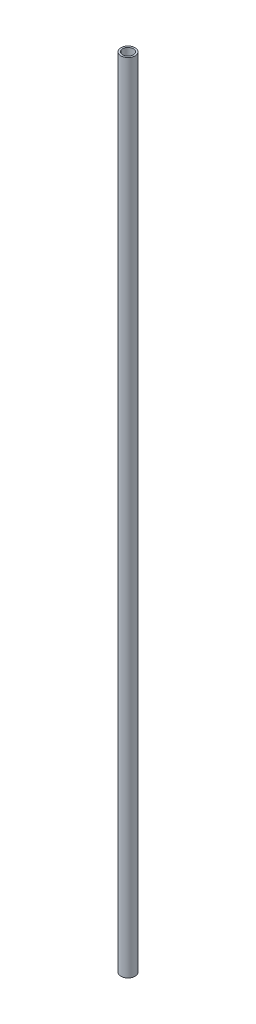
ISO-10303-21;
HEADER;
FILE_DESCRIPTION(('STEP AP214'),'2;1');
FILE_NAME('part.step','',(''),(''),'','','');
FILE_SCHEMA(('AUTOMOTIVE_DESIGN { 1 0 10303 214 1 1 1 1 }'));
ENDSEC;
DATA;
#1=APPLICATION_CONTEXT('core data for automotive mechanical design processes');
#2=APPLICATION_PROTOCOL_DEFINITION('international standard','automotive_design',2000,#1);
#3=PRODUCT_CONTEXT('',#1,'mechanical');
#4=PRODUCT('Part','Part','',(#3));
#5=PRODUCT_RELATED_PRODUCT_CATEGORY('part','',(#4));
#6=PRODUCT_DEFINITION_FORMATION('','',#4);
#7=PRODUCT_DEFINITION_CONTEXT('part definition',#1,'design');
#8=PRODUCT_DEFINITION('design','',#6,#7);
#9=PRODUCT_DEFINITION_SHAPE('','',#8);
#10=(LENGTH_UNIT() NAMED_UNIT(*) SI_UNIT(.MILLI.,.METRE.));
#11=(NAMED_UNIT(*) PLANE_ANGLE_UNIT() SI_UNIT($,.RADIAN.));
#12=(NAMED_UNIT(*) SI_UNIT($,.STERADIAN.) SOLID_ANGLE_UNIT());
#13=UNCERTAINTY_MEASURE_WITH_UNIT(LENGTH_MEASURE(1.E-05),#10,'distance_accuracy_value','');
#14=(GEOMETRIC_REPRESENTATION_CONTEXT(3) GLOBAL_UNCERTAINTY_ASSIGNED_CONTEXT((#13)) GLOBAL_UNIT_ASSIGNED_CONTEXT((#10,
#11,#12)) REPRESENTATION_CONTEXT('',''));
#15=CARTESIAN_POINT('',(0.,0.,0.));
#16=DIRECTION('',(0.,0.,1.));
#17=DIRECTION('',(1.,0.,0.));
#18=AXIS2_PLACEMENT_3D('',#15,#16,#17);
#19=CARTESIAN_POINT('',(0.,0.,0.));
#20=DIRECTION('',(0.,1.,0.));
#21=DIRECTION('',(0.,0.,1.));
#22=AXIS2_PLACEMENT_3D('',#19,#20,#21);
#23=CYLINDRICAL_SURFACE('',#22,4.);
#24=CARTESIAN_POINT('',(0.,450.,0.));
#25=DIRECTION('',(0.,1.,0.));
#26=DIRECTION('',(0.,0.,1.));
#27=AXIS2_PLACEMENT_3D('',#24,#25,#26);
#28=CIRCLE('',#27,4.);
#29=CARTESIAN_POINT('',(0.,450.,4.));
#30=VERTEX_POINT('',#29);
#31=EDGE_CURVE('E50',#30,#30,#28,.T.);
#32=ORIENTED_EDGE('',*,*,#31,.F.);
#33=EDGE_LOOP('',(#32));
#34=FACE_BOUND('',#33,.T.);
#35=CARTESIAN_POINT('',(0.,0.,0.));
#36=DIRECTION('',(0.,1.,0.));
#37=DIRECTION('',(0.,0.,1.));
#38=AXIS2_PLACEMENT_3D('',#35,#36,#37);
#39=CIRCLE('',#38,4.);
#40=CARTESIAN_POINT('',(0.,0.,4.));
#41=VERTEX_POINT('',#40);
#42=EDGE_CURVE('E35',#41,#41,#39,.T.);
#43=ORIENTED_EDGE('',*,*,#42,.T.);
#44=EDGE_LOOP('',(#43));
#45=FACE_BOUND('',#44,.T.);
#46=ADVANCED_FACE('F32',(#34,#45),#23,.T.);
#47=CARTESIAN_POINT('',(0.,0.,0.));
#48=DIRECTION('',(0.,1.,0.));
#49=DIRECTION('',(0.,0.,1.));
#50=AXIS2_PLACEMENT_3D('',#47,#48,#49);
#51=PLANE('',#50);
#52=CARTESIAN_POINT('',(0.,0.,0.));
#53=DIRECTION('',(0.,1.,0.));
#54=DIRECTION('',(0.,0.,1.));
#55=AXIS2_PLACEMENT_3D('',#52,#53,#54);
#56=CIRCLE('',#55,3.);
#57=CARTESIAN_POINT('',(0.,0.,3.));
#58=VERTEX_POINT('',#57);
#59=EDGE_CURVE('E40',#58,#58,#56,.F.);
#60=ORIENTED_EDGE('',*,*,#59,.F.);
#61=EDGE_LOOP('',(#60));
#62=FACE_BOUND('',#61,.T.);
#63=ORIENTED_EDGE('',*,*,#42,.F.);
#64=EDGE_LOOP('',(#63));
#65=FACE_BOUND('',#64,.T.);
#66=ADVANCED_FACE('F68',(#62,#65),#51,.F.);
#67=CARTESIAN_POINT('',(0.,450.,0.));
#68=DIRECTION('',(0.,1.,0.));
#69=DIRECTION('',(0.,0.,1.));
#70=AXIS2_PLACEMENT_3D('',#67,#68,#69);
#71=PLANE('',#70);
#72=CARTESIAN_POINT('',(0.,450.,0.));
#73=DIRECTION('',(0.,1.,0.));
#74=DIRECTION('',(0.,0.,1.));
#75=AXIS2_PLACEMENT_3D('',#72,#73,#74);
#76=CIRCLE('',#75,3.);
#77=CARTESIAN_POINT('',(0.,450.,3.));
#78=VERTEX_POINT('',#77);
#79=EDGE_CURVE('E11',#78,#78,#76,.F.);
#80=ORIENTED_EDGE('',*,*,#79,.T.);
#81=EDGE_LOOP('',(#80));
#82=FACE_BOUND('',#81,.T.);
#83=ORIENTED_EDGE('',*,*,#31,.T.);
#84=EDGE_LOOP('',(#83));
#85=FACE_BOUND('',#84,.T.);
#86=ADVANCED_FACE('F57',(#82,#85),#71,.T.);
#87=CARTESIAN_POINT('',(0.,0.,0.));
#88=DIRECTION('',(0.,1.,0.));
#89=DIRECTION('',(0.,0.,1.));
#90=AXIS2_PLACEMENT_3D('',#87,#88,#89);
#91=CYLINDRICAL_SURFACE('',#90,3.);
#92=ORIENTED_EDGE('',*,*,#79,.F.);
#93=EDGE_LOOP('',(#92));
#94=FACE_BOUND('',#93,.T.);
#95=ORIENTED_EDGE('',*,*,#59,.T.);
#96=EDGE_LOOP('',(#95));
#97=FACE_BOUND('',#96,.T.);
#98=ADVANCED_FACE('F60',(#94,#97),#91,.F.);
#99=CLOSED_SHELL('',(#46,#66,#86,#98));
#100=MANIFOLD_SOLID_BREP('B2',#99);
#101=ADVANCED_BREP_SHAPE_REPRESENTATION('',(#18,#100),#14);
#102=SHAPE_DEFINITION_REPRESENTATION(#9,#101);
ENDSEC;
END-ISO-10303-21;
